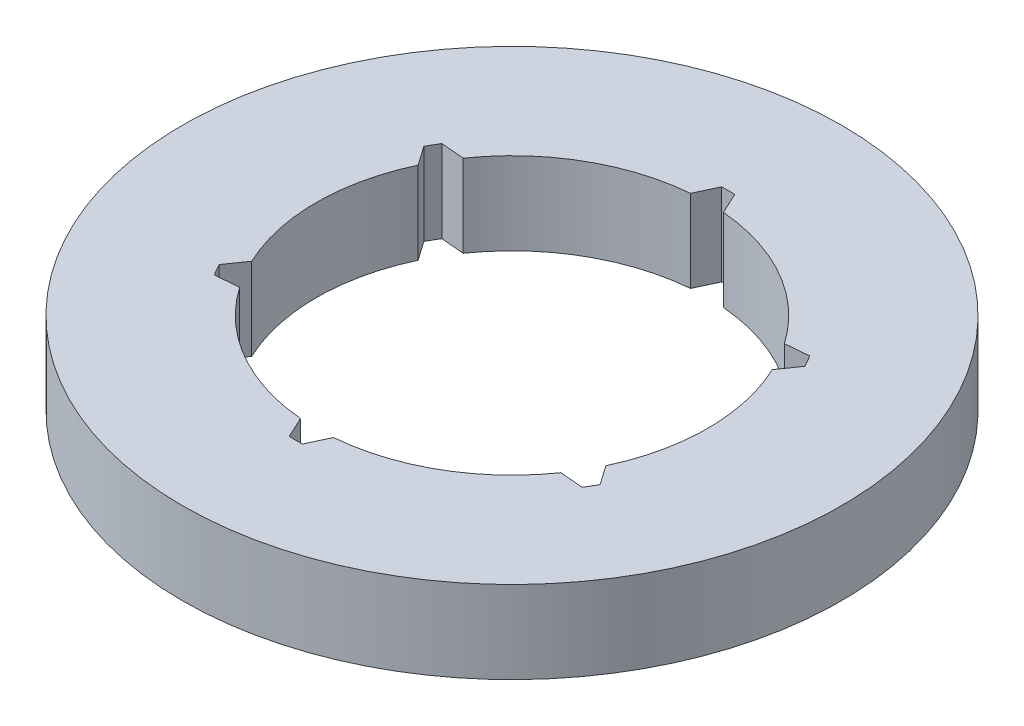
ISO-10303-21;
HEADER;
FILE_DESCRIPTION(('STEP AP214'),'2;1');
FILE_NAME('part.step','',(''),(''),'','','');
FILE_SCHEMA(('AUTOMOTIVE_DESIGN { 1 0 10303 214 1 1 1 1 }'));
ENDSEC;
DATA;
#1=APPLICATION_CONTEXT('core data for automotive mechanical design processes');
#2=APPLICATION_PROTOCOL_DEFINITION('international standard','automotive_design',2000,#1);
#3=PRODUCT_CONTEXT('',#1,'mechanical');
#4=PRODUCT('Part','Part','',(#3));
#5=PRODUCT_RELATED_PRODUCT_CATEGORY('part','',(#4));
#6=PRODUCT_DEFINITION_FORMATION('','',#4);
#7=PRODUCT_DEFINITION_CONTEXT('part definition',#1,'design');
#8=PRODUCT_DEFINITION('design','',#6,#7);
#9=PRODUCT_DEFINITION_SHAPE('','',#8);
#10=(LENGTH_UNIT() NAMED_UNIT(*) SI_UNIT(.MILLI.,.METRE.));
#11=(NAMED_UNIT(*) PLANE_ANGLE_UNIT() SI_UNIT($,.RADIAN.));
#12=(NAMED_UNIT(*) SI_UNIT($,.STERADIAN.) SOLID_ANGLE_UNIT());
#13=UNCERTAINTY_MEASURE_WITH_UNIT(LENGTH_MEASURE(1.E-05),#10,'distance_accuracy_value','');
#14=(GEOMETRIC_REPRESENTATION_CONTEXT(3) GLOBAL_UNCERTAINTY_ASSIGNED_CONTEXT((#13)) GLOBAL_UNIT_ASSIGNED_CONTEXT((#10,
#11,#12)) REPRESENTATION_CONTEXT('',''));
#15=CARTESIAN_POINT('',(0.,0.,0.));
#16=DIRECTION('',(0.,0.,1.));
#17=DIRECTION('',(1.,0.,0.));
#18=AXIS2_PLACEMENT_3D('',#15,#16,#17);
#19=CARTESIAN_POINT('',(0.,10.,0.));
#20=DIRECTION('',(0.,1.,0.));
#21=DIRECTION('',(0.,0.,1.));
#22=AXIS2_PLACEMENT_3D('',#19,#20,#21);
#23=PLANE('',#22);
#24=CARTESIAN_POINT('',(0.,10.,0.));
#25=DIRECTION('',(0.,1.,0.));
#26=DIRECTION('',(0.,0.,1.));
#27=AXIS2_PLACEMENT_3D('',#24,#25,#26);
#28=CIRCLE('',#27,40.);
#29=CARTESIAN_POINT('',(0.,10.,40.));
#30=VERTEX_POINT('',#29);
#31=EDGE_CURVE('E11',#30,#30,#28,.T.);
#32=ORIENTED_EDGE('',*,*,#31,.T.);
#33=EDGE_LOOP('',(#32));
#34=FACE_BOUND('',#33,.T.);
#35=DIRECTION('',(-0.422618261740694,0.,-0.906307787036652));
#36=VECTOR('',#35,1.);
#37=CARTESIAN_POINT('',(2.,10.,-23.6656396490777));
#38=LINE('',#37,#36);
#39=CARTESIAN_POINT('',(2.,10.,-23.6656396490777));
#40=VERTEX_POINT('',#39);
#41=CARTESIAN_POINT('',(0.800587161147835,10.,-26.2377887825442));
#42=VERTEX_POINT('',#41);
#43=EDGE_CURVE('E202',#40,#42,#38,.T.);
#44=ORIENTED_EDGE('',*,*,#43,.F.);
#45=CARTESIAN_POINT('',(0.,10.,0.));
#46=DIRECTION('',(0.,1.,0.));
#47=DIRECTION('',(0.,0.,1.));
#48=AXIS2_PLACEMENT_3D('',#45,#46,#47);
#49=CIRCLE('',#48,23.75);
#50=CARTESIAN_POINT('',(19.4950451329096,10.,-13.5648706321077));
#51=VERTEX_POINT('',#50);
#52=EDGE_CURVE('E194',#51,#40,#49,.T.);
#53=ORIENTED_EDGE('',*,*,#52,.F.);
#54=DIRECTION('',(-0.996194698091745,0.,0.0871557427476618));
#55=VECTOR('',#54,1.);
#56=CARTESIAN_POINT('',(19.4950451329096,10.,-13.5648706321077));
#57=LINE('',#56,#55);
#58=CARTESIAN_POINT('',(22.3222980442398,10.,-13.8122232107698));
#59=VERTEX_POINT('',#58);
#60=EDGE_CURVE('E258',#59,#51,#57,.T.);
#61=ORIENTED_EDGE('',*,*,#60,.F.);
#62=CARTESIAN_POINT('',(0.,10.,0.));
#63=DIRECTION('',(0.,1.,0.));
#64=DIRECTION('',(0.,0.,1.));
#65=AXIS2_PLACEMENT_3D('',#62,#63,#64);
#66=CIRCLE('',#65,26.25);
#67=CARTESIAN_POINT('',(23.1228852053876,10.,-12.4255655717744));
#68=VERTEX_POINT('',#67);
#69=EDGE_CURVE('E256',#68,#59,#66,.T.);
#70=ORIENTED_EDGE('',*,*,#69,.F.);
#71=DIRECTION('',(0.573576436351052,0.,-0.819152044288987));
#72=VECTOR('',#71,1.);
#73=CARTESIAN_POINT('',(21.4950451329096,10.,-10.1007690169699));
#74=LINE('',#73,#72);
#75=CARTESIAN_POINT('',(21.4950451329096,10.,-10.1007690169699));
#76=VERTEX_POINT('',#75);
#77=EDGE_CURVE('E254',#76,#68,#74,.T.);
#78=ORIENTED_EDGE('',*,*,#77,.F.);
#79=CARTESIAN_POINT('',(0.,10.,0.));
#80=DIRECTION('',(0.,1.,0.));
#81=DIRECTION('',(0.,0.,1.));
#82=AXIS2_PLACEMENT_3D('',#79,#80,#81);
#83=CIRCLE('',#82,23.75);
#84=CARTESIAN_POINT('',(21.4950451329095,10.,10.1007690169701));
#85=VERTEX_POINT('',#84);
#86=EDGE_CURVE('E252',#85,#76,#83,.T.);
#87=ORIENTED_EDGE('',*,*,#86,.F.);
#88=DIRECTION('',(-0.573576436351047,0.,-0.819152044288991));
#89=VECTOR('',#88,1.);
#90=CARTESIAN_POINT('',(21.4950451329095,10.,10.1007690169701));
#91=LINE('',#90,#89);
#92=CARTESIAN_POINT('',(23.1228852053876,10.,12.4255655717745));
#93=VERTEX_POINT('',#92);
#94=EDGE_CURVE('E250',#93,#85,#91,.T.);
#95=ORIENTED_EDGE('',*,*,#94,.F.);
#96=CARTESIAN_POINT('',(0.,10.,0.));
#97=DIRECTION('',(0.,1.,0.));
#98=DIRECTION('',(0.,0.,1.));
#99=AXIS2_PLACEMENT_3D('',#96,#97,#98);
#100=CIRCLE('',#99,26.25);
#101=CARTESIAN_POINT('',(22.3222980442397,10.,13.8122232107699));
#102=VERTEX_POINT('',#101);
#103=EDGE_CURVE('E248',#102,#93,#100,.T.);
#104=ORIENTED_EDGE('',*,*,#103,.F.);
#105=DIRECTION('',(0.996194698091745,0.,0.0871557427476691));
#106=VECTOR('',#105,1.);
#107=CARTESIAN_POINT('',(19.4950451329095,10.,13.5648706321078));
#108=LINE('',#107,#106);
#109=CARTESIAN_POINT('',(19.4950451329095,10.,13.5648706321078));
#110=VERTEX_POINT('',#109);
#111=EDGE_CURVE('E246',#110,#102,#108,.T.);
#112=ORIENTED_EDGE('',*,*,#111,.F.);
#113=CARTESIAN_POINT('',(0.,10.,0.));
#114=DIRECTION('',(0.,1.,0.));
#115=DIRECTION('',(0.,0.,1.));
#116=AXIS2_PLACEMENT_3D('',#113,#114,#115);
#117=CIRCLE('',#116,23.75);
#118=CARTESIAN_POINT('',(1.99999999999983,10.,23.6656396490777));
#119=VERTEX_POINT('',#118);
#120=EDGE_CURVE('E244',#119,#110,#117,.T.);
#121=ORIENTED_EDGE('',*,*,#120,.F.);
#122=DIRECTION('',(0.4226182617407,0.,-0.90630778703665));
#123=VECTOR('',#122,1.);
#124=CARTESIAN_POINT('',(1.99999999999983,10.,23.6656396490777));
#125=LINE('',#124,#123);
#126=CARTESIAN_POINT('',(0.800587161147656,10.,26.2377887825443));
#127=VERTEX_POINT('',#126);
#128=EDGE_CURVE('E242',#127,#119,#125,.T.);
#129=ORIENTED_EDGE('',*,*,#128,.F.);
#130=CARTESIAN_POINT('',(0.,10.,0.));
#131=DIRECTION('',(0.,1.,0.));
#132=DIRECTION('',(0.,0.,1.));
#133=AXIS2_PLACEMENT_3D('',#130,#131,#132);
#134=CIRCLE('',#133,26.25);
#135=CARTESIAN_POINT('',(-0.800587161148017,10.,26.2377887825442));
#136=VERTEX_POINT('',#135);
#137=EDGE_CURVE('E240',#136,#127,#134,.T.);
#138=ORIENTED_EDGE('',*,*,#137,.F.);
#139=DIRECTION('',(0.422618261740688,0.,0.906307787036655));
#140=VECTOR('',#139,1.);
#141=CARTESIAN_POINT('',(-2.00000000000016,10.,23.6656396490777));
#142=LINE('',#141,#140);
#143=CARTESIAN_POINT('',(-2.00000000000018,10.,23.6656396490777));
#144=VERTEX_POINT('',#143);
#145=EDGE_CURVE('E238',#144,#136,#142,.T.);
#146=ORIENTED_EDGE('',*,*,#145,.F.);
#147=CARTESIAN_POINT('',(0.,10.,0.));
#148=DIRECTION('',(0.,1.,0.));
#149=DIRECTION('',(0.,0.,1.));
#150=AXIS2_PLACEMENT_3D('',#147,#148,#149);
#151=CIRCLE('',#150,23.75);
#152=CARTESIAN_POINT('',(-19.4950451329097,10.,13.5648706321076));
#153=VERTEX_POINT('',#152);
#154=EDGE_CURVE('E236',#153,#144,#151,.T.);
#155=ORIENTED_EDGE('',*,*,#154,.F.);
#156=DIRECTION('',(0.996194698091746,0.,-0.087155742747655));
#157=VECTOR('',#156,1.);
#158=CARTESIAN_POINT('',(-19.4950451329097,10.,13.5648706321076));
#159=LINE('',#158,#157);
#160=CARTESIAN_POINT('',(-22.3222980442399,10.,13.8122232107696));
#161=VERTEX_POINT('',#160);
#162=EDGE_CURVE('E234',#161,#153,#159,.T.);
#163=ORIENTED_EDGE('',*,*,#162,.F.);
#164=CARTESIAN_POINT('',(0.,10.,0.));
#165=DIRECTION('',(0.,1.,0.));
#166=DIRECTION('',(0.,0.,1.));
#167=AXIS2_PLACEMENT_3D('',#164,#165,#166);
#168=CIRCLE('',#167,26.25);
#169=CARTESIAN_POINT('',(-23.1228852053877,10.,12.4255655717742));
#170=VERTEX_POINT('',#169);
#171=EDGE_CURVE('E232',#170,#161,#168,.T.);
#172=ORIENTED_EDGE('',*,*,#171,.F.);
#173=DIRECTION('',(-0.573576436351059,0.,0.819152044288983));
#174=VECTOR('',#173,1.);
#175=CARTESIAN_POINT('',(-21.4950451329097,10.,10.1007690169698));
#176=LINE('',#175,#174);
#177=CARTESIAN_POINT('',(-21.4950451329097,10.,10.1007690169698));
#178=VERTEX_POINT('',#177);
#179=EDGE_CURVE('E230',#178,#170,#176,.T.);
#180=ORIENTED_EDGE('',*,*,#179,.F.);
#181=CARTESIAN_POINT('',(0.,10.,0.));
#182=DIRECTION('',(0.,1.,0.));
#183=DIRECTION('',(0.,0.,1.));
#184=AXIS2_PLACEMENT_3D('',#181,#182,#183);
#185=CIRCLE('',#184,23.75);
#186=CARTESIAN_POINT('',(-21.4950451329094,10.,-10.1007690169702));
#187=VERTEX_POINT('',#186);
#188=EDGE_CURVE('E228',#187,#178,#185,.T.);
#189=ORIENTED_EDGE('',*,*,#188,.F.);
#190=DIRECTION('',(0.573576436351041,0.,0.819152044288995));
#191=VECTOR('',#190,1.);
#192=CARTESIAN_POINT('',(-21.4950451329094,10.,-10.1007690169702));
#193=LINE('',#192,#191);
#194=CARTESIAN_POINT('',(-23.1228852053875,10.,-12.4255655717747));
#195=VERTEX_POINT('',#194);
#196=EDGE_CURVE('E226',#195,#187,#193,.T.);
#197=ORIENTED_EDGE('',*,*,#196,.F.);
#198=CARTESIAN_POINT('',(0.,10.,0.));
#199=DIRECTION('',(0.,1.,0.));
#200=DIRECTION('',(0.,0.,1.));
#201=AXIS2_PLACEMENT_3D('',#198,#199,#200);
#202=CIRCLE('',#201,26.25);
#203=CARTESIAN_POINT('',(-22.3222980442396,10.,-13.8122232107701));
#204=VERTEX_POINT('',#203);
#205=EDGE_CURVE('E224',#204,#195,#202,.T.);
#206=ORIENTED_EDGE('',*,*,#205,.F.);
#207=DIRECTION('',(-0.996194698091744,0.,-0.0871557427476759));
#208=VECTOR('',#207,1.);
#209=CARTESIAN_POINT('',(-19.4950451329094,10.,-13.564870632108));
#210=LINE('',#209,#208);
#211=CARTESIAN_POINT('',(-19.4950451329094,10.,-13.564870632108));
#212=VERTEX_POINT('',#211);
#213=EDGE_CURVE('E222',#212,#204,#210,.T.);
#214=ORIENTED_EDGE('',*,*,#213,.F.);
#215=CARTESIAN_POINT('',(0.,10.,0.));
#216=DIRECTION('',(0.,1.,0.));
#217=DIRECTION('',(0.,0.,1.));
#218=AXIS2_PLACEMENT_3D('',#215,#216,#217);
#219=CIRCLE('',#218,23.75);
#220=CARTESIAN_POINT('',(-2.,10.,-23.6656396490777));
#221=VERTEX_POINT('',#220);
#222=EDGE_CURVE('E220',#221,#212,#219,.T.);
#223=ORIENTED_EDGE('',*,*,#222,.F.);
#224=DIRECTION('',(-0.422618261740694,0.,0.906307787036652));
#225=VECTOR('',#224,1.);
#226=CARTESIAN_POINT('',(-2.,10.,-23.6656396490777));
#227=LINE('',#226,#225);
#228=CARTESIAN_POINT('',(-0.800587161147828,10.,-26.2377887825443));
#229=VERTEX_POINT('',#228);
#230=EDGE_CURVE('E216',#229,#221,#227,.T.);
#231=ORIENTED_EDGE('',*,*,#230,.F.);
#232=CARTESIAN_POINT('',(0.,10.,0.));
#233=DIRECTION('',(0.,1.,0.));
#234=DIRECTION('',(0.,0.,1.));
#235=AXIS2_PLACEMENT_3D('',#232,#233,#234);
#236=CIRCLE('',#235,26.25);
#237=EDGE_CURVE('E214',#42,#229,#236,.T.);
#238=ORIENTED_EDGE('',*,*,#237,.F.);
#239=EDGE_LOOP('',(#44,#53,#61,#70,#78,#87,#95,#104,#112,#121,#129,#138,#146,#155,#163,#172,
#180,#189,#197,#206,#214,#223,#231,#238));
#240=FACE_BOUND('',#239,.T.);
#241=ADVANCED_FACE('F33',(#34,#240),#23,.T.);
#242=CARTESIAN_POINT('',(0.,0.,0.));
#243=DIRECTION('',(0.,1.,0.));
#244=DIRECTION('',(0.,0.,1.));
#245=AXIS2_PLACEMENT_3D('',#242,#243,#244);
#246=PLANE('',#245);
#247=CARTESIAN_POINT('',(0.,0.,0.));
#248=DIRECTION('',(0.,1.,0.));
#249=DIRECTION('',(0.,0.,1.));
#250=AXIS2_PLACEMENT_3D('',#247,#248,#249);
#251=CIRCLE('',#250,40.);
#252=CARTESIAN_POINT('',(0.,0.,40.));
#253=VERTEX_POINT('',#252);
#254=EDGE_CURVE('E37',#253,#253,#251,.T.);
#255=ORIENTED_EDGE('',*,*,#254,.F.);
#256=EDGE_LOOP('',(#255));
#257=FACE_BOUND('',#256,.T.);
#258=CARTESIAN_POINT('',(0.,0.,0.));
#259=DIRECTION('',(0.,1.,0.));
#260=DIRECTION('',(0.,0.,1.));
#261=AXIS2_PLACEMENT_3D('',#258,#259,#260);
#262=CIRCLE('',#261,23.75);
#263=CARTESIAN_POINT('',(19.4950451329096,0.,-13.5648706321077));
#264=VERTEX_POINT('',#263);
#265=CARTESIAN_POINT('',(2.,0.,-23.6656396490777));
#266=VERTEX_POINT('',#265);
#267=EDGE_CURVE('E56',#264,#266,#262,.T.);
#268=ORIENTED_EDGE('',*,*,#267,.T.);
#269=DIRECTION('',(-0.422618261740694,0.,-0.906307787036652));
#270=VECTOR('',#269,1.);
#271=CARTESIAN_POINT('',(2.,0.,-23.6656396490777));
#272=LINE('',#271,#270);
#273=CARTESIAN_POINT('',(0.800587161147835,0.,-26.2377887825442));
#274=VERTEX_POINT('',#273);
#275=EDGE_CURVE('E209',#266,#274,#272,.T.);
#276=ORIENTED_EDGE('',*,*,#275,.T.);
#277=CARTESIAN_POINT('',(0.,0.,0.));
#278=DIRECTION('',(0.,1.,0.));
#279=DIRECTION('',(0.,0.,1.));
#280=AXIS2_PLACEMENT_3D('',#277,#278,#279);
#281=CIRCLE('',#280,26.25);
#282=CARTESIAN_POINT('',(-0.800587161147828,0.,-26.2377887825443));
#283=VERTEX_POINT('',#282);
#284=EDGE_CURVE('E262',#274,#283,#281,.T.);
#285=ORIENTED_EDGE('',*,*,#284,.T.);
#286=DIRECTION('',(-0.422618261740694,0.,0.906307787036652));
#287=VECTOR('',#286,1.);
#288=CARTESIAN_POINT('',(-2.,0.,-23.6656396490777));
#289=LINE('',#288,#287);
#290=CARTESIAN_POINT('',(-2.,0.,-23.6656396490777));
#291=VERTEX_POINT('',#290);
#292=EDGE_CURVE('E265',#283,#291,#289,.T.);
#293=ORIENTED_EDGE('',*,*,#292,.T.);
#294=CARTESIAN_POINT('',(0.,0.,0.));
#295=DIRECTION('',(0.,1.,0.));
#296=DIRECTION('',(0.,0.,1.));
#297=AXIS2_PLACEMENT_3D('',#294,#295,#296);
#298=CIRCLE('',#297,23.75);
#299=CARTESIAN_POINT('',(-19.4950451329094,0.,-13.564870632108));
#300=VERTEX_POINT('',#299);
#301=EDGE_CURVE('E268',#291,#300,#298,.T.);
#302=ORIENTED_EDGE('',*,*,#301,.T.);
#303=DIRECTION('',(-0.996194698091744,0.,-0.0871557427476759));
#304=VECTOR('',#303,1.);
#305=CARTESIAN_POINT('',(-19.4950451329094,0.,-13.564870632108));
#306=LINE('',#305,#304);
#307=CARTESIAN_POINT('',(-22.3222980442396,0.,-13.8122232107701));
#308=VERTEX_POINT('',#307);
#309=EDGE_CURVE('E271',#300,#308,#306,.T.);
#310=ORIENTED_EDGE('',*,*,#309,.T.);
#311=CARTESIAN_POINT('',(0.,0.,0.));
#312=DIRECTION('',(0.,1.,0.));
#313=DIRECTION('',(0.,0.,1.));
#314=AXIS2_PLACEMENT_3D('',#311,#312,#313);
#315=CIRCLE('',#314,26.25);
#316=CARTESIAN_POINT('',(-23.1228852053875,0.,-12.4255655717747));
#317=VERTEX_POINT('',#316);
#318=EDGE_CURVE('E274',#308,#317,#315,.T.);
#319=ORIENTED_EDGE('',*,*,#318,.T.);
#320=DIRECTION('',(0.573576436351041,0.,0.819152044288995));
#321=VECTOR('',#320,1.);
#322=CARTESIAN_POINT('',(-21.4950451329094,0.,-10.1007690169702));
#323=LINE('',#322,#321);
#324=CARTESIAN_POINT('',(-21.4950451329094,0.,-10.1007690169702));
#325=VERTEX_POINT('',#324);
#326=EDGE_CURVE('E277',#317,#325,#323,.T.);
#327=ORIENTED_EDGE('',*,*,#326,.T.);
#328=CARTESIAN_POINT('',(0.,0.,0.));
#329=DIRECTION('',(0.,1.,0.));
#330=DIRECTION('',(0.,0.,1.));
#331=AXIS2_PLACEMENT_3D('',#328,#329,#330);
#332=CIRCLE('',#331,23.75);
#333=CARTESIAN_POINT('',(-21.4950451329097,0.,10.1007690169698));
#334=VERTEX_POINT('',#333);
#335=EDGE_CURVE('E280',#325,#334,#332,.T.);
#336=ORIENTED_EDGE('',*,*,#335,.T.);
#337=DIRECTION('',(-0.573576436351059,0.,0.819152044288983));
#338=VECTOR('',#337,1.);
#339=CARTESIAN_POINT('',(-21.4950451329097,0.,10.1007690169698));
#340=LINE('',#339,#338);
#341=CARTESIAN_POINT('',(-23.1228852053877,0.,12.4255655717742));
#342=VERTEX_POINT('',#341);
#343=EDGE_CURVE('E283',#334,#342,#340,.T.);
#344=ORIENTED_EDGE('',*,*,#343,.T.);
#345=CARTESIAN_POINT('',(0.,0.,0.));
#346=DIRECTION('',(0.,1.,0.));
#347=DIRECTION('',(0.,0.,1.));
#348=AXIS2_PLACEMENT_3D('',#345,#346,#347);
#349=CIRCLE('',#348,26.25);
#350=CARTESIAN_POINT('',(-22.3222980442399,0.,13.8122232107696));
#351=VERTEX_POINT('',#350);
#352=EDGE_CURVE('E286',#342,#351,#349,.T.);
#353=ORIENTED_EDGE('',*,*,#352,.T.);
#354=DIRECTION('',(0.996194698091746,0.,-0.087155742747655));
#355=VECTOR('',#354,1.);
#356=CARTESIAN_POINT('',(-19.4950451329097,0.,13.5648706321076));
#357=LINE('',#356,#355);
#358=CARTESIAN_POINT('',(-19.4950451329097,0.,13.5648706321076));
#359=VERTEX_POINT('',#358);
#360=EDGE_CURVE('E289',#351,#359,#357,.T.);
#361=ORIENTED_EDGE('',*,*,#360,.T.);
#362=CARTESIAN_POINT('',(0.,0.,0.));
#363=DIRECTION('',(0.,1.,0.));
#364=DIRECTION('',(0.,0.,1.));
#365=AXIS2_PLACEMENT_3D('',#362,#363,#364);
#366=CIRCLE('',#365,23.75);
#367=CARTESIAN_POINT('',(-2.00000000000018,0.,23.6656396490777));
#368=VERTEX_POINT('',#367);
#369=EDGE_CURVE('E292',#359,#368,#366,.T.);
#370=ORIENTED_EDGE('',*,*,#369,.T.);
#371=DIRECTION('',(0.422618261740688,0.,0.906307787036655));
#372=VECTOR('',#371,1.);
#373=CARTESIAN_POINT('',(-2.00000000000016,0.,23.6656396490777));
#374=LINE('',#373,#372);
#375=CARTESIAN_POINT('',(-0.800587161148017,0.,26.2377887825442));
#376=VERTEX_POINT('',#375);
#377=EDGE_CURVE('E295',#368,#376,#374,.T.);
#378=ORIENTED_EDGE('',*,*,#377,.T.);
#379=CARTESIAN_POINT('',(0.,0.,0.));
#380=DIRECTION('',(0.,1.,0.));
#381=DIRECTION('',(0.,0.,1.));
#382=AXIS2_PLACEMENT_3D('',#379,#380,#381);
#383=CIRCLE('',#382,26.25);
#384=CARTESIAN_POINT('',(0.800587161147656,0.,26.2377887825443));
#385=VERTEX_POINT('',#384);
#386=EDGE_CURVE('E298',#376,#385,#383,.T.);
#387=ORIENTED_EDGE('',*,*,#386,.T.);
#388=DIRECTION('',(0.4226182617407,0.,-0.90630778703665));
#389=VECTOR('',#388,1.);
#390=CARTESIAN_POINT('',(1.99999999999983,0.,23.6656396490777));
#391=LINE('',#390,#389);
#392=CARTESIAN_POINT('',(1.99999999999983,0.,23.6656396490777));
#393=VERTEX_POINT('',#392);
#394=EDGE_CURVE('E301',#385,#393,#391,.T.);
#395=ORIENTED_EDGE('',*,*,#394,.T.);
#396=CARTESIAN_POINT('',(0.,0.,0.));
#397=DIRECTION('',(0.,1.,0.));
#398=DIRECTION('',(0.,0.,1.));
#399=AXIS2_PLACEMENT_3D('',#396,#397,#398);
#400=CIRCLE('',#399,23.75);
#401=CARTESIAN_POINT('',(19.4950451329095,0.,13.5648706321078));
#402=VERTEX_POINT('',#401);
#403=EDGE_CURVE('E304',#393,#402,#400,.T.);
#404=ORIENTED_EDGE('',*,*,#403,.T.);
#405=DIRECTION('',(0.996194698091745,0.,0.0871557427476691));
#406=VECTOR('',#405,1.);
#407=CARTESIAN_POINT('',(19.4950451329095,0.,13.5648706321078));
#408=LINE('',#407,#406);
#409=CARTESIAN_POINT('',(22.3222980442397,0.,13.8122232107699));
#410=VERTEX_POINT('',#409);
#411=EDGE_CURVE('E307',#402,#410,#408,.T.);
#412=ORIENTED_EDGE('',*,*,#411,.T.);
#413=CARTESIAN_POINT('',(0.,0.,0.));
#414=DIRECTION('',(0.,1.,0.));
#415=DIRECTION('',(0.,0.,1.));
#416=AXIS2_PLACEMENT_3D('',#413,#414,#415);
#417=CIRCLE('',#416,26.25);
#418=CARTESIAN_POINT('',(23.1228852053876,0.,12.4255655717745));
#419=VERTEX_POINT('',#418);
#420=EDGE_CURVE('E310',#410,#419,#417,.T.);
#421=ORIENTED_EDGE('',*,*,#420,.T.);
#422=DIRECTION('',(-0.573576436351047,0.,-0.819152044288991));
#423=VECTOR('',#422,1.);
#424=CARTESIAN_POINT('',(21.4950451329095,0.,10.1007690169701));
#425=LINE('',#424,#423);
#426=CARTESIAN_POINT('',(21.4950451329095,0.,10.1007690169701));
#427=VERTEX_POINT('',#426);
#428=EDGE_CURVE('E313',#419,#427,#425,.T.);
#429=ORIENTED_EDGE('',*,*,#428,.T.);
#430=CARTESIAN_POINT('',(0.,0.,0.));
#431=DIRECTION('',(0.,1.,0.));
#432=DIRECTION('',(0.,0.,1.));
#433=AXIS2_PLACEMENT_3D('',#430,#431,#432);
#434=CIRCLE('',#433,23.75);
#435=CARTESIAN_POINT('',(21.4950451329096,0.,-10.1007690169699));
#436=VERTEX_POINT('',#435);
#437=EDGE_CURVE('E316',#427,#436,#434,.T.);
#438=ORIENTED_EDGE('',*,*,#437,.T.);
#439=DIRECTION('',(0.573576436351052,0.,-0.819152044288987));
#440=VECTOR('',#439,1.);
#441=CARTESIAN_POINT('',(21.4950451329096,0.,-10.1007690169699));
#442=LINE('',#441,#440);
#443=CARTESIAN_POINT('',(23.1228852053876,0.,-12.4255655717744));
#444=VERTEX_POINT('',#443);
#445=EDGE_CURVE('E319',#436,#444,#442,.T.);
#446=ORIENTED_EDGE('',*,*,#445,.T.);
#447=CARTESIAN_POINT('',(0.,0.,0.));
#448=DIRECTION('',(0.,1.,0.));
#449=DIRECTION('',(0.,0.,1.));
#450=AXIS2_PLACEMENT_3D('',#447,#448,#449);
#451=CIRCLE('',#450,26.25);
#452=CARTESIAN_POINT('',(22.3222980442398,0.,-13.8122232107698));
#453=VERTEX_POINT('',#452);
#454=EDGE_CURVE('E322',#444,#453,#451,.T.);
#455=ORIENTED_EDGE('',*,*,#454,.T.);
#456=DIRECTION('',(-0.996194698091745,0.,0.0871557427476618));
#457=VECTOR('',#456,1.);
#458=CARTESIAN_POINT('',(19.4950451329096,0.,-13.5648706321077));
#459=LINE('',#458,#457);
#460=EDGE_CURVE('E203',#453,#264,#459,.T.);
#461=ORIENTED_EDGE('',*,*,#460,.T.);
#462=EDGE_LOOP('',(#268,#276,#285,#293,#302,#310,#319,#327,#336,#344,#353,#361,#370,#378,#387,
#395,#404,#412,#421,#429,#438,#446,#455,#461));
#463=FACE_BOUND('',#462,.T.);
#464=ADVANCED_FACE('F375',(#257,#463),#246,.F.);
#465=CARTESIAN_POINT('',(0.,10.,0.));
#466=DIRECTION('',(0.,-1.,0.));
#467=DIRECTION('',(0.,0.,-1.));
#468=AXIS2_PLACEMENT_3D('',#465,#466,#467);
#469=CYLINDRICAL_SURFACE('',#468,40.);
#470=ORIENTED_EDGE('',*,*,#31,.F.);
#471=EDGE_LOOP('',(#470));
#472=FACE_BOUND('',#471,.T.);
#473=ORIENTED_EDGE('',*,*,#254,.T.);
#474=EDGE_LOOP('',(#473));
#475=FACE_BOUND('',#474,.T.);
#476=ADVANCED_FACE('F35',(#472,#475),#469,.T.);
#477=CARTESIAN_POINT('',(0.,10.,0.));
#478=DIRECTION('',(0.,-1.,0.));
#479=DIRECTION('',(0.,0.,-1.));
#480=AXIS2_PLACEMENT_3D('',#477,#478,#479);
#481=CYLINDRICAL_SURFACE('',#480,23.75);
#482=ORIENTED_EDGE('',*,*,#267,.F.);
#483=DIRECTION('',(0.,-1.,0.));
#484=VECTOR('',#483,1.);
#485=CARTESIAN_POINT('',(19.4950451329096,10.,-13.5648706321077));
#486=LINE('',#485,#484);
#487=EDGE_CURVE('E198',#51,#264,#486,.T.);
#488=ORIENTED_EDGE('',*,*,#487,.F.);
#489=ORIENTED_EDGE('',*,*,#52,.T.);
#490=DIRECTION('',(0.,-1.,0.));
#491=VECTOR('',#490,1.);
#492=CARTESIAN_POINT('',(2.,10.,-23.6656396490777));
#493=LINE('',#492,#491);
#494=EDGE_CURVE('E197',#40,#266,#493,.T.);
#495=ORIENTED_EDGE('',*,*,#494,.T.);
#496=EDGE_LOOP('',(#482,#488,#489,#495));
#497=FACE_BOUND('',#496,.T.);
#498=ADVANCED_FACE('F196',(#497),#481,.F.);
#499=CARTESIAN_POINT('',(2.,10.,-23.6656396490777));
#500=DIRECTION('',(-0.906307787036653,0.,0.422618261740694));
#501=DIRECTION('',(0.422618261740694,0.,0.906307787036653));
#502=AXIS2_PLACEMENT_3D('',#499,#500,#501);
#503=PLANE('',#502);
#504=ORIENTED_EDGE('',*,*,#275,.F.);
#505=ORIENTED_EDGE('',*,*,#494,.F.);
#506=ORIENTED_EDGE('',*,*,#43,.T.);
#507=DIRECTION('',(0.,-1.,0.));
#508=VECTOR('',#507,1.);
#509=CARTESIAN_POINT('',(0.800587161147835,10.,-26.2377887825442));
#510=LINE('',#509,#508);
#511=EDGE_CURVE('E210',#42,#274,#510,.T.);
#512=ORIENTED_EDGE('',*,*,#511,.T.);
#513=EDGE_LOOP('',(#504,#505,#506,#512));
#514=FACE_BOUND('',#513,.T.);
#515=ADVANCED_FACE('F206',(#514),#503,.T.);
#516=CARTESIAN_POINT('',(0.,10.,0.));
#517=DIRECTION('',(0.,-1.,0.));
#518=DIRECTION('',(0.,0.,-1.));
#519=AXIS2_PLACEMENT_3D('',#516,#517,#518);
#520=CYLINDRICAL_SURFACE('',#519,26.25);
#521=ORIENTED_EDGE('',*,*,#284,.F.);
#522=ORIENTED_EDGE('',*,*,#511,.F.);
#523=ORIENTED_EDGE('',*,*,#237,.T.);
#524=DIRECTION('',(0.,-1.,0.));
#525=VECTOR('',#524,1.);
#526=CARTESIAN_POINT('',(-0.800587161147828,10.,-26.2377887825443));
#527=LINE('',#526,#525);
#528=EDGE_CURVE('E367',#229,#283,#527,.T.);
#529=ORIENTED_EDGE('',*,*,#528,.T.);
#530=EDGE_LOOP('',(#521,#522,#523,#529));
#531=FACE_BOUND('',#530,.T.);
#532=ADVANCED_FACE('F371',(#531),#520,.F.);
#533=CARTESIAN_POINT('',(-2.,10.,-23.6656396490777));
#534=DIRECTION('',(0.906307787036653,0.,0.422618261740694));
#535=DIRECTION('',(0.422618261740694,0.,-0.906307787036653));
#536=AXIS2_PLACEMENT_3D('',#533,#534,#535);
#537=PLANE('',#536);
#538=ORIENTED_EDGE('',*,*,#292,.F.);
#539=ORIENTED_EDGE('',*,*,#528,.F.);
#540=ORIENTED_EDGE('',*,*,#230,.T.);
#541=DIRECTION('',(0.,-1.,0.));
#542=VECTOR('',#541,1.);
#543=CARTESIAN_POINT('',(-2.,10.,-23.6656396490777));
#544=LINE('',#543,#542);
#545=EDGE_CURVE('E365',#221,#291,#544,.T.);
#546=ORIENTED_EDGE('',*,*,#545,.T.);
#547=EDGE_LOOP('',(#538,#539,#540,#546));
#548=FACE_BOUND('',#547,.T.);
#549=ADVANCED_FACE('F473',(#548),#537,.T.);
#550=CARTESIAN_POINT('',(0.,10.,0.));
#551=DIRECTION('',(0.,-1.,0.));
#552=DIRECTION('',(0.,0.,-1.));
#553=AXIS2_PLACEMENT_3D('',#550,#551,#552);
#554=CYLINDRICAL_SURFACE('',#553,23.75);
#555=ORIENTED_EDGE('',*,*,#301,.F.);
#556=ORIENTED_EDGE('',*,*,#545,.F.);
#557=ORIENTED_EDGE('',*,*,#222,.T.);
#558=DIRECTION('',(0.,-1.,0.));
#559=VECTOR('',#558,1.);
#560=CARTESIAN_POINT('',(-19.4950451329094,10.,-13.564870632108));
#561=LINE('',#560,#559);
#562=EDGE_CURVE('E363',#212,#300,#561,.T.);
#563=ORIENTED_EDGE('',*,*,#562,.T.);
#564=EDGE_LOOP('',(#555,#556,#557,#563));
#565=FACE_BOUND('',#564,.T.);
#566=ADVANCED_FACE('F471',(#565),#554,.F.);
#567=CARTESIAN_POINT('',(-19.4950451329094,10.,-13.564870632108));
#568=DIRECTION('',(-0.0871557427476759,0.,0.996194698091744));
#569=DIRECTION('',(0.996194698091744,0.,0.0871557427476759));
#570=AXIS2_PLACEMENT_3D('',#567,#568,#569);
#571=PLANE('',#570);
#572=ORIENTED_EDGE('',*,*,#309,.F.);
#573=ORIENTED_EDGE('',*,*,#562,.F.);
#574=ORIENTED_EDGE('',*,*,#213,.T.);
#575=DIRECTION('',(0.,-1.,0.));
#576=VECTOR('',#575,1.);
#577=CARTESIAN_POINT('',(-22.3222980442396,10.,-13.8122232107701));
#578=LINE('',#577,#576);
#579=EDGE_CURVE('E361',#204,#308,#578,.T.);
#580=ORIENTED_EDGE('',*,*,#579,.T.);
#581=EDGE_LOOP('',(#572,#573,#574,#580));
#582=FACE_BOUND('',#581,.T.);
#583=ADVANCED_FACE('F465',(#582),#571,.T.);
#584=CARTESIAN_POINT('',(0.,10.,0.));
#585=DIRECTION('',(0.,-1.,0.));
#586=DIRECTION('',(0.,0.,-1.));
#587=AXIS2_PLACEMENT_3D('',#584,#585,#586);
#588=CYLINDRICAL_SURFACE('',#587,26.25);
#589=ORIENTED_EDGE('',*,*,#318,.F.);
#590=ORIENTED_EDGE('',*,*,#579,.F.);
#591=ORIENTED_EDGE('',*,*,#205,.T.);
#592=DIRECTION('',(0.,-1.,0.));
#593=VECTOR('',#592,1.);
#594=CARTESIAN_POINT('',(-23.1228852053875,10.,-12.4255655717747));
#595=LINE('',#594,#593);
#596=EDGE_CURVE('E359',#195,#317,#595,.T.);
#597=ORIENTED_EDGE('',*,*,#596,.T.);
#598=EDGE_LOOP('',(#589,#590,#591,#597));
#599=FACE_BOUND('',#598,.T.);
#600=ADVANCED_FACE('F461',(#599),#588,.F.);
#601=CARTESIAN_POINT('',(-21.4950451329094,10.,-10.1007690169702));
#602=DIRECTION('',(0.819152044288995,0.,-0.573576436351041));
#603=DIRECTION('',(-0.573576436351041,0.,-0.819152044288995));
#604=AXIS2_PLACEMENT_3D('',#601,#602,#603);
#605=PLANE('',#604);
#606=ORIENTED_EDGE('',*,*,#326,.F.);
#607=ORIENTED_EDGE('',*,*,#596,.F.);
#608=ORIENTED_EDGE('',*,*,#196,.T.);
#609=DIRECTION('',(0.,-1.,0.));
#610=VECTOR('',#609,1.);
#611=CARTESIAN_POINT('',(-21.4950451329094,10.,-10.1007690169702));
#612=LINE('',#611,#610);
#613=EDGE_CURVE('E357',#187,#325,#612,.T.);
#614=ORIENTED_EDGE('',*,*,#613,.T.);
#615=EDGE_LOOP('',(#606,#607,#608,#614));
#616=FACE_BOUND('',#615,.T.);
#617=ADVANCED_FACE('F458',(#616),#605,.T.);
#618=CARTESIAN_POINT('',(0.,10.,0.));
#619=DIRECTION('',(0.,-1.,0.));
#620=DIRECTION('',(0.,0.,-1.));
#621=AXIS2_PLACEMENT_3D('',#618,#619,#620);
#622=CYLINDRICAL_SURFACE('',#621,23.75);
#623=ORIENTED_EDGE('',*,*,#335,.F.);
#624=ORIENTED_EDGE('',*,*,#613,.F.);
#625=ORIENTED_EDGE('',*,*,#188,.T.);
#626=DIRECTION('',(0.,-1.,0.));
#627=VECTOR('',#626,1.);
#628=CARTESIAN_POINT('',(-21.4950451329097,10.,10.1007690169698));
#629=LINE('',#628,#627);
#630=EDGE_CURVE('E355',#178,#334,#629,.T.);
#631=ORIENTED_EDGE('',*,*,#630,.T.);
#632=EDGE_LOOP('',(#623,#624,#625,#631));
#633=FACE_BOUND('',#632,.T.);
#634=ADVANCED_FACE('F450',(#633),#622,.F.);
#635=CARTESIAN_POINT('',(-21.4950451329097,10.,10.1007690169698));
#636=DIRECTION('',(0.819152044288983,0.,0.573576436351059));
#637=DIRECTION('',(0.573576436351059,0.,-0.819152044288983));
#638=AXIS2_PLACEMENT_3D('',#635,#636,#637);
#639=PLANE('',#638);
#640=ORIENTED_EDGE('',*,*,#343,.F.);
#641=ORIENTED_EDGE('',*,*,#630,.F.);
#642=ORIENTED_EDGE('',*,*,#179,.T.);
#643=DIRECTION('',(0.,-1.,0.));
#644=VECTOR('',#643,1.);
#645=CARTESIAN_POINT('',(-23.1228852053877,10.,12.4255655717742));
#646=LINE('',#645,#644);
#647=EDGE_CURVE('E353',#170,#342,#646,.T.);
#648=ORIENTED_EDGE('',*,*,#647,.T.);
#649=EDGE_LOOP('',(#640,#641,#642,#648));
#650=FACE_BOUND('',#649,.T.);
#651=ADVANCED_FACE('F446',(#650),#639,.T.);
#652=CARTESIAN_POINT('',(0.,10.,0.));
#653=DIRECTION('',(0.,-1.,0.));
#654=DIRECTION('',(0.,0.,-1.));
#655=AXIS2_PLACEMENT_3D('',#652,#653,#654);
#656=CYLINDRICAL_SURFACE('',#655,26.25);
#657=ORIENTED_EDGE('',*,*,#352,.F.);
#658=ORIENTED_EDGE('',*,*,#647,.F.);
#659=ORIENTED_EDGE('',*,*,#171,.T.);
#660=DIRECTION('',(0.,-1.,0.));
#661=VECTOR('',#660,1.);
#662=CARTESIAN_POINT('',(-22.3222980442399,10.,13.8122232107696));
#663=LINE('',#662,#661);
#664=EDGE_CURVE('E351',#161,#351,#663,.T.);
#665=ORIENTED_EDGE('',*,*,#664,.T.);
#666=EDGE_LOOP('',(#657,#658,#659,#665));
#667=FACE_BOUND('',#666,.T.);
#668=ADVANCED_FACE('F443',(#667),#656,.F.);
#669=CARTESIAN_POINT('',(-19.4950451329097,10.,13.5648706321076));
#670=DIRECTION('',(-0.087155742747655,0.,-0.996194698091746));
#671=DIRECTION('',(-0.996194698091746,0.,0.087155742747655));
#672=AXIS2_PLACEMENT_3D('',#669,#670,#671);
#673=PLANE('',#672);
#674=ORIENTED_EDGE('',*,*,#360,.F.);
#675=ORIENTED_EDGE('',*,*,#664,.F.);
#676=ORIENTED_EDGE('',*,*,#162,.T.);
#677=DIRECTION('',(0.,-1.,0.));
#678=VECTOR('',#677,1.);
#679=CARTESIAN_POINT('',(-19.4950451329097,10.,13.5648706321076));
#680=LINE('',#679,#678);
#681=EDGE_CURVE('E349',#153,#359,#680,.T.);
#682=ORIENTED_EDGE('',*,*,#681,.T.);
#683=EDGE_LOOP('',(#674,#675,#676,#682));
#684=FACE_BOUND('',#683,.T.);
#685=ADVANCED_FACE('F435',(#684),#673,.T.);
#686=CARTESIAN_POINT('',(0.,10.,0.));
#687=DIRECTION('',(0.,-1.,0.));
#688=DIRECTION('',(0.,0.,-1.));
#689=AXIS2_PLACEMENT_3D('',#686,#687,#688);
#690=CYLINDRICAL_SURFACE('',#689,23.75);
#691=ORIENTED_EDGE('',*,*,#369,.F.);
#692=ORIENTED_EDGE('',*,*,#681,.F.);
#693=ORIENTED_EDGE('',*,*,#154,.T.);
#694=DIRECTION('',(0.,-1.,0.));
#695=VECTOR('',#694,1.);
#696=CARTESIAN_POINT('',(-2.00000000000018,10.,23.6656396490777));
#697=LINE('',#696,#695);
#698=EDGE_CURVE('E347',#144,#368,#697,.T.);
#699=ORIENTED_EDGE('',*,*,#698,.T.);
#700=EDGE_LOOP('',(#691,#692,#693,#699));
#701=FACE_BOUND('',#700,.T.);
#702=ADVANCED_FACE('F431',(#701),#690,.F.);
#703=CARTESIAN_POINT('',(-2.00000000000016,10.,23.6656396490777));
#704=DIRECTION('',(0.906307787036655,0.,-0.422618261740688));
#705=DIRECTION('',(-0.422618261740688,0.,-0.906307787036655));
#706=AXIS2_PLACEMENT_3D('',#703,#704,#705);
#707=PLANE('',#706);
#708=ORIENTED_EDGE('',*,*,#377,.F.);
#709=ORIENTED_EDGE('',*,*,#698,.F.);
#710=ORIENTED_EDGE('',*,*,#145,.T.);
#711=DIRECTION('',(0.,-1.,0.));
#712=VECTOR('',#711,1.);
#713=CARTESIAN_POINT('',(-0.800587161148017,10.,26.2377887825442));
#714=LINE('',#713,#712);
#715=EDGE_CURVE('E345',#136,#376,#714,.T.);
#716=ORIENTED_EDGE('',*,*,#715,.T.);
#717=EDGE_LOOP('',(#708,#709,#710,#716));
#718=FACE_BOUND('',#717,.T.);
#719=ADVANCED_FACE('F428',(#718),#707,.T.);
#720=CARTESIAN_POINT('',(0.,10.,0.));
#721=DIRECTION('',(0.,-1.,0.));
#722=DIRECTION('',(0.,0.,-1.));
#723=AXIS2_PLACEMENT_3D('',#720,#721,#722);
#724=CYLINDRICAL_SURFACE('',#723,26.25);
#725=ORIENTED_EDGE('',*,*,#386,.F.);
#726=ORIENTED_EDGE('',*,*,#715,.F.);
#727=ORIENTED_EDGE('',*,*,#137,.T.);
#728=DIRECTION('',(0.,-1.,0.));
#729=VECTOR('',#728,1.);
#730=CARTESIAN_POINT('',(0.800587161147656,10.,26.2377887825443));
#731=LINE('',#730,#729);
#732=EDGE_CURVE('E343',#127,#385,#731,.T.);
#733=ORIENTED_EDGE('',*,*,#732,.T.);
#734=EDGE_LOOP('',(#725,#726,#727,#733));
#735=FACE_BOUND('',#734,.T.);
#736=ADVANCED_FACE('F420',(#735),#724,.F.);
#737=CARTESIAN_POINT('',(1.99999999999983,10.,23.6656396490777));
#738=DIRECTION('',(-0.90630778703665,0.,-0.4226182617407));
#739=DIRECTION('',(-0.4226182617407,0.,0.90630778703665));
#740=AXIS2_PLACEMENT_3D('',#737,#738,#739);
#741=PLANE('',#740);
#742=ORIENTED_EDGE('',*,*,#394,.F.);
#743=ORIENTED_EDGE('',*,*,#732,.F.);
#744=ORIENTED_EDGE('',*,*,#128,.T.);
#745=DIRECTION('',(0.,-1.,0.));
#746=VECTOR('',#745,1.);
#747=CARTESIAN_POINT('',(1.99999999999983,10.,23.6656396490777));
#748=LINE('',#747,#746);
#749=EDGE_CURVE('E341',#119,#393,#748,.T.);
#750=ORIENTED_EDGE('',*,*,#749,.T.);
#751=EDGE_LOOP('',(#742,#743,#744,#750));
#752=FACE_BOUND('',#751,.T.);
#753=ADVANCED_FACE('F416',(#752),#741,.T.);
#754=CARTESIAN_POINT('',(0.,10.,0.));
#755=DIRECTION('',(0.,-1.,0.));
#756=DIRECTION('',(0.,0.,-1.));
#757=AXIS2_PLACEMENT_3D('',#754,#755,#756);
#758=CYLINDRICAL_SURFACE('',#757,23.75);
#759=ORIENTED_EDGE('',*,*,#403,.F.);
#760=ORIENTED_EDGE('',*,*,#749,.F.);
#761=ORIENTED_EDGE('',*,*,#120,.T.);
#762=DIRECTION('',(0.,-1.,0.));
#763=VECTOR('',#762,1.);
#764=CARTESIAN_POINT('',(19.4950451329095,10.,13.5648706321078));
#765=LINE('',#764,#763);
#766=EDGE_CURVE('E339',#110,#402,#765,.T.);
#767=ORIENTED_EDGE('',*,*,#766,.T.);
#768=EDGE_LOOP('',(#759,#760,#761,#767));
#769=FACE_BOUND('',#768,.T.);
#770=ADVANCED_FACE('F413',(#769),#758,.F.);
#771=CARTESIAN_POINT('',(19.4950451329095,10.,13.5648706321078));
#772=DIRECTION('',(0.0871557427476691,0.,-0.996194698091745));
#773=DIRECTION('',(-0.996194698091745,0.,-0.0871557427476691));
#774=AXIS2_PLACEMENT_3D('',#771,#772,#773);
#775=PLANE('',#774);
#776=ORIENTED_EDGE('',*,*,#411,.F.);
#777=ORIENTED_EDGE('',*,*,#766,.F.);
#778=ORIENTED_EDGE('',*,*,#111,.T.);
#779=DIRECTION('',(0.,-1.,0.));
#780=VECTOR('',#779,1.);
#781=CARTESIAN_POINT('',(22.3222980442397,10.,13.8122232107699));
#782=LINE('',#781,#780);
#783=EDGE_CURVE('E337',#102,#410,#782,.T.);
#784=ORIENTED_EDGE('',*,*,#783,.T.);
#785=EDGE_LOOP('',(#776,#777,#778,#784));
#786=FACE_BOUND('',#785,.T.);
#787=ADVANCED_FACE('F405',(#786),#775,.T.);
#788=CARTESIAN_POINT('',(0.,10.,0.));
#789=DIRECTION('',(0.,-1.,0.));
#790=DIRECTION('',(0.,0.,-1.));
#791=AXIS2_PLACEMENT_3D('',#788,#789,#790);
#792=CYLINDRICAL_SURFACE('',#791,26.25);
#793=ORIENTED_EDGE('',*,*,#420,.F.);
#794=ORIENTED_EDGE('',*,*,#783,.F.);
#795=ORIENTED_EDGE('',*,*,#103,.T.);
#796=DIRECTION('',(0.,-1.,0.));
#797=VECTOR('',#796,1.);
#798=CARTESIAN_POINT('',(23.1228852053876,10.,12.4255655717745));
#799=LINE('',#798,#797);
#800=EDGE_CURVE('E335',#93,#419,#799,.T.);
#801=ORIENTED_EDGE('',*,*,#800,.T.);
#802=EDGE_LOOP('',(#793,#794,#795,#801));
#803=FACE_BOUND('',#802,.T.);
#804=ADVANCED_FACE('F401',(#803),#792,.F.);
#805=CARTESIAN_POINT('',(21.4950451329095,10.,10.1007690169701));
#806=DIRECTION('',(-0.819152044288991,0.,0.573576436351047));
#807=DIRECTION('',(0.573576436351047,0.,0.819152044288991));
#808=AXIS2_PLACEMENT_3D('',#805,#806,#807);
#809=PLANE('',#808);
#810=ORIENTED_EDGE('',*,*,#428,.F.);
#811=ORIENTED_EDGE('',*,*,#800,.F.);
#812=ORIENTED_EDGE('',*,*,#94,.T.);
#813=DIRECTION('',(0.,-1.,0.));
#814=VECTOR('',#813,1.);
#815=CARTESIAN_POINT('',(21.4950451329095,10.,10.1007690169701));
#816=LINE('',#815,#814);
#817=EDGE_CURVE('E333',#85,#427,#816,.T.);
#818=ORIENTED_EDGE('',*,*,#817,.T.);
#819=EDGE_LOOP('',(#810,#811,#812,#818));
#820=FACE_BOUND('',#819,.T.);
#821=ADVANCED_FACE('F398',(#820),#809,.T.);
#822=CARTESIAN_POINT('',(0.,10.,0.));
#823=DIRECTION('',(0.,-1.,0.));
#824=DIRECTION('',(0.,0.,-1.));
#825=AXIS2_PLACEMENT_3D('',#822,#823,#824);
#826=CYLINDRICAL_SURFACE('',#825,23.75);
#827=ORIENTED_EDGE('',*,*,#437,.F.);
#828=ORIENTED_EDGE('',*,*,#817,.F.);
#829=ORIENTED_EDGE('',*,*,#86,.T.);
#830=DIRECTION('',(0.,-1.,0.));
#831=VECTOR('',#830,1.);
#832=CARTESIAN_POINT('',(21.4950451329096,10.,-10.1007690169699));
#833=LINE('',#832,#831);
#834=EDGE_CURVE('E331',#76,#436,#833,.T.);
#835=ORIENTED_EDGE('',*,*,#834,.T.);
#836=EDGE_LOOP('',(#827,#828,#829,#835));
#837=FACE_BOUND('',#836,.T.);
#838=ADVANCED_FACE('F390',(#837),#826,.F.);
#839=CARTESIAN_POINT('',(21.4950451329096,10.,-10.1007690169699));
#840=DIRECTION('',(-0.819152044288987,0.,-0.573576436351052));
#841=DIRECTION('',(-0.573576436351052,0.,0.819152044288987));
#842=AXIS2_PLACEMENT_3D('',#839,#840,#841);
#843=PLANE('',#842);
#844=ORIENTED_EDGE('',*,*,#445,.F.);
#845=ORIENTED_EDGE('',*,*,#834,.F.);
#846=ORIENTED_EDGE('',*,*,#77,.T.);
#847=DIRECTION('',(0.,-1.,0.));
#848=VECTOR('',#847,1.);
#849=CARTESIAN_POINT('',(23.1228852053876,10.,-12.4255655717744));
#850=LINE('',#849,#848);
#851=EDGE_CURVE('E329',#68,#444,#850,.T.);
#852=ORIENTED_EDGE('',*,*,#851,.T.);
#853=EDGE_LOOP('',(#844,#845,#846,#852));
#854=FACE_BOUND('',#853,.T.);
#855=ADVANCED_FACE('F386',(#854),#843,.T.);
#856=CARTESIAN_POINT('',(0.,10.,0.));
#857=DIRECTION('',(0.,-1.,0.));
#858=DIRECTION('',(0.,0.,-1.));
#859=AXIS2_PLACEMENT_3D('',#856,#857,#858);
#860=CYLINDRICAL_SURFACE('',#859,26.25);
#861=ORIENTED_EDGE('',*,*,#454,.F.);
#862=ORIENTED_EDGE('',*,*,#851,.F.);
#863=ORIENTED_EDGE('',*,*,#69,.T.);
#864=DIRECTION('',(0.,-1.,0.));
#865=VECTOR('',#864,1.);
#866=CARTESIAN_POINT('',(22.3222980442398,10.,-13.8122232107698));
#867=LINE('',#866,#865);
#868=EDGE_CURVE('E48',#59,#453,#867,.T.);
#869=ORIENTED_EDGE('',*,*,#868,.T.);
#870=EDGE_LOOP('',(#861,#862,#863,#869));
#871=FACE_BOUND('',#870,.T.);
#872=ADVANCED_FACE('F383',(#871),#860,.F.);
#873=CARTESIAN_POINT('',(19.4950451329096,10.,-13.5648706321077));
#874=DIRECTION('',(0.0871557427476618,0.,0.996194698091745));
#875=DIRECTION('',(0.996194698091745,0.,-0.0871557427476618));
#876=AXIS2_PLACEMENT_3D('',#873,#874,#875);
#877=PLANE('',#876);
#878=ORIENTED_EDGE('',*,*,#460,.F.);
#879=ORIENTED_EDGE('',*,*,#868,.F.);
#880=ORIENTED_EDGE('',*,*,#60,.T.);
#881=ORIENTED_EDGE('',*,*,#487,.T.);
#882=EDGE_LOOP('',(#878,#879,#880,#881));
#883=FACE_BOUND('',#882,.T.);
#884=ADVANCED_FACE('F377',(#883),#877,.T.);
#885=CLOSED_SHELL('',(#241,#464,#476,#498,#515,#532,#549,#566,#583,#600,#617,#634,#651,#668,
#685,#702,#719,#736,#753,#770,#787,#804,#821,#838,#855,#872,#884));
#886=MANIFOLD_SOLID_BREP('B2',#885);
#887=ADVANCED_BREP_SHAPE_REPRESENTATION('',(#18,#886),#14);
#888=SHAPE_DEFINITION_REPRESENTATION(#9,#887);
ENDSEC;
END-ISO-10303-21;
